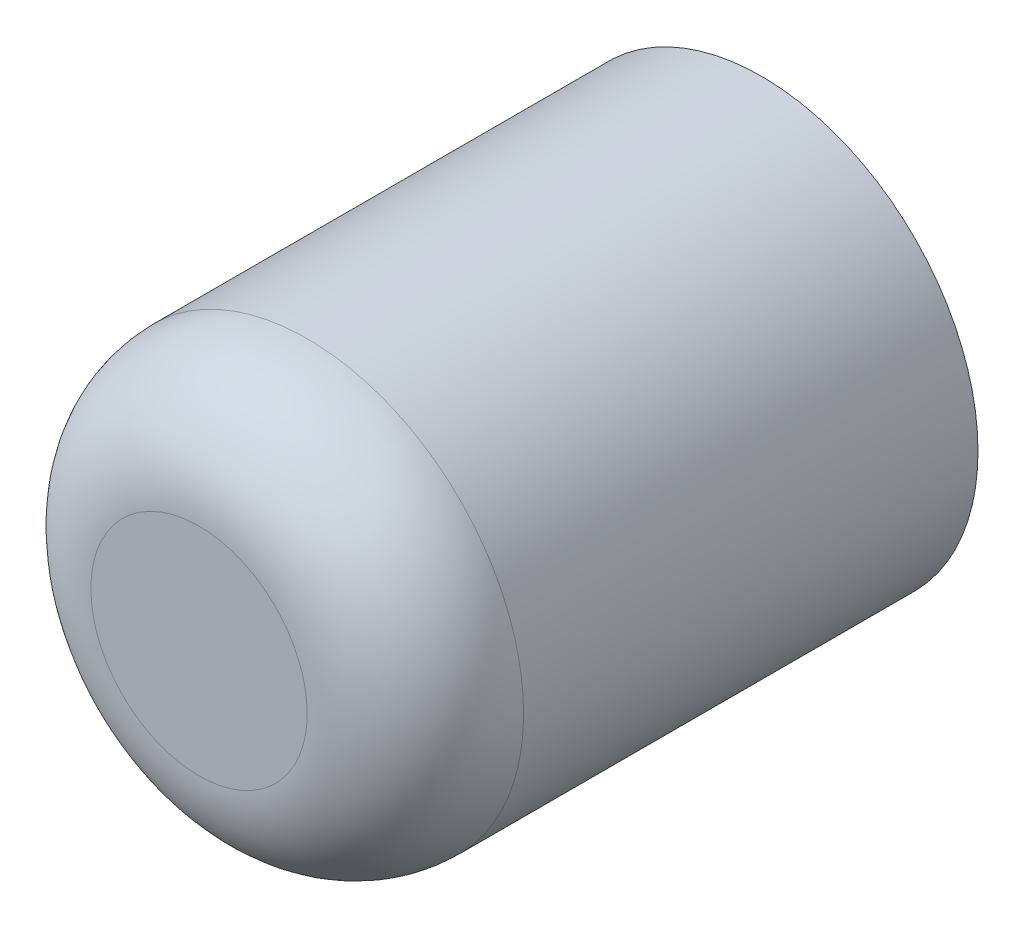
ISO-10303-21;
HEADER;
FILE_DESCRIPTION(('STEP AP214'),'2;1');
FILE_NAME('part.step','',(''),(''),'','','');
FILE_SCHEMA(('AUTOMOTIVE_DESIGN { 1 0 10303 214 1 1 1 1 }'));
ENDSEC;
DATA;
#1=APPLICATION_CONTEXT('core data for automotive mechanical design processes');
#2=APPLICATION_PROTOCOL_DEFINITION('international standard','automotive_design',2000,#1);
#3=PRODUCT_CONTEXT('',#1,'mechanical');
#4=PRODUCT('Part','Part','',(#3));
#5=PRODUCT_RELATED_PRODUCT_CATEGORY('part','',(#4));
#6=PRODUCT_DEFINITION_FORMATION('','',#4);
#7=PRODUCT_DEFINITION_CONTEXT('part definition',#1,'design');
#8=PRODUCT_DEFINITION('design','',#6,#7);
#9=PRODUCT_DEFINITION_SHAPE('','',#8);
#10=(LENGTH_UNIT() NAMED_UNIT(*) SI_UNIT(.MILLI.,.METRE.));
#11=(NAMED_UNIT(*) PLANE_ANGLE_UNIT() SI_UNIT($,.RADIAN.));
#12=(NAMED_UNIT(*) SI_UNIT($,.STERADIAN.) SOLID_ANGLE_UNIT());
#13=UNCERTAINTY_MEASURE_WITH_UNIT(LENGTH_MEASURE(1.E-05),#10,'distance_accuracy_value','');
#14=(GEOMETRIC_REPRESENTATION_CONTEXT(3) GLOBAL_UNCERTAINTY_ASSIGNED_CONTEXT((#13)) GLOBAL_UNIT_ASSIGNED_CONTEXT((#10,
#11,#12)) REPRESENTATION_CONTEXT('',''));
#15=CARTESIAN_POINT('',(0.,0.,0.));
#16=DIRECTION('',(0.,0.,1.));
#17=DIRECTION('',(1.,0.,0.));
#18=AXIS2_PLACEMENT_3D('',#15,#16,#17);
#19=CARTESIAN_POINT('',(0.,0.,0.));
#20=DIRECTION('',(0.,0.,1.));
#21=DIRECTION('',(1.,0.,0.));
#22=AXIS2_PLACEMENT_3D('',#19,#20,#21);
#23=PLANE('',#22);
#24=CARTESIAN_POINT('',(0.,0.,0.));
#25=DIRECTION('',(0.,0.,1.));
#26=DIRECTION('',(1.,0.,0.));
#27=AXIS2_PLACEMENT_3D('',#24,#25,#26);
#28=CIRCLE('',#27,6.35);
#29=CARTESIAN_POINT('',(6.35,0.,0.));
#30=VERTEX_POINT('',#29);
#31=EDGE_CURVE('E10',#30,#30,#28,.T.);
#32=ORIENTED_EDGE('',*,*,#31,.F.);
#33=EDGE_LOOP('',(#32));
#34=FACE_BOUND('',#33,.T.);
#35=ADVANCED_FACE('F15',(#34),#23,.F.);
#36=CARTESIAN_POINT('',(0.,0.,16.51));
#37=DIRECTION('',(0.,0.,1.));
#38=DIRECTION('',(1.,0.,0.));
#39=AXIS2_PLACEMENT_3D('',#36,#37,#38);
#40=PLANE('',#39);
#41=CARTESIAN_POINT('',(0.,0.,16.51));
#42=DIRECTION('',(0.,0.,-1.));
#43=DIRECTION('',(-1.,0.,0.));
#44=AXIS2_PLACEMENT_3D('',#41,#42,#43);
#45=CIRCLE('',#44,3.175);
#46=CARTESIAN_POINT('',(-3.175,0.,16.51));
#47=VERTEX_POINT('',#46);
#48=EDGE_CURVE('E32',#47,#47,#45,.T.);
#49=ORIENTED_EDGE('',*,*,#48,.F.);
#50=EDGE_LOOP('',(#49));
#51=FACE_BOUND('',#50,.T.);
#52=ADVANCED_FACE('F41',(#51),#40,.T.);
#53=CARTESIAN_POINT('',(0.,0.,0.));
#54=DIRECTION('',(0.,0.,1.));
#55=DIRECTION('',(1.,0.,0.));
#56=AXIS2_PLACEMENT_3D('',#53,#54,#55);
#57=CYLINDRICAL_SURFACE('',#56,6.35);
#58=ORIENTED_EDGE('',*,*,#31,.T.);
#59=EDGE_LOOP('',(#58));
#60=FACE_BOUND('',#59,.T.);
#61=CARTESIAN_POINT('',(0.,0.,13.335));
#62=DIRECTION('',(0.,0.,1.));
#63=DIRECTION('',(-1.,0.,0.));
#64=AXIS2_PLACEMENT_3D('',#61,#62,#63);
#65=CIRCLE('',#64,6.35);
#66=CARTESIAN_POINT('',(-6.35,0.,13.335));
#67=VERTEX_POINT('',#66);
#68=EDGE_CURVE('E19',#67,#67,#65,.T.);
#69=ORIENTED_EDGE('',*,*,#68,.F.);
#70=EDGE_LOOP('',(#69));
#71=FACE_BOUND('',#70,.T.);
#72=ADVANCED_FACE('F43',(#60,#71),#57,.T.);
#73=CARTESIAN_POINT('',(0.,0.,13.335));
#74=DIRECTION('',(0.,0.,1.));
#75=DIRECTION('',(1.,0.,0.));
#76=AXIS2_PLACEMENT_3D('',#73,#74,#75);
#77=DEGENERATE_TOROIDAL_SURFACE('',#76,3.17499999999999,3.17500000000001,.T.);
#78=ORIENTED_EDGE('',*,*,#68,.T.);
#79=EDGE_LOOP('',(#78));
#80=FACE_BOUND('',#79,.T.);
#81=ORIENTED_EDGE('',*,*,#48,.T.);
#82=EDGE_LOOP('',(#81));
#83=FACE_BOUND('',#82,.T.);
#84=ADVANCED_FACE('F17',(#80,#83),#77,.T.);
#85=CLOSED_SHELL('',(#35,#52,#72,#84));
#86=MANIFOLD_SOLID_BREP('B1',#85);
#87=ADVANCED_BREP_SHAPE_REPRESENTATION('',(#18,#86),#14);
#88=SHAPE_DEFINITION_REPRESENTATION(#9,#87);
ENDSEC;
END-ISO-10303-21;
